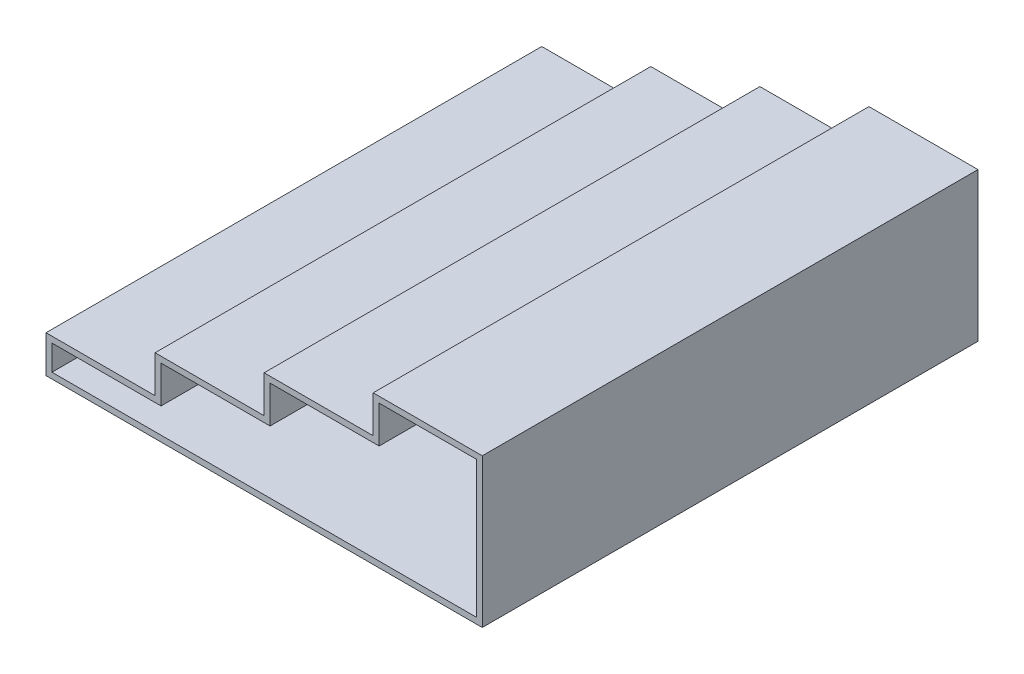
ISO-10303-21;
HEADER;
FILE_DESCRIPTION(('STEP AP214'),'2;1');
FILE_NAME('part.step','',(''),(''),'','','');
FILE_SCHEMA(('AUTOMOTIVE_DESIGN { 1 0 10303 214 1 1 1 1 }'));
ENDSEC;
DATA;
#1=APPLICATION_CONTEXT('core data for automotive mechanical design processes');
#2=APPLICATION_PROTOCOL_DEFINITION('international standard','automotive_design',2000,#1);
#3=PRODUCT_CONTEXT('',#1,'mechanical');
#4=PRODUCT('Part','Part','',(#3));
#5=PRODUCT_RELATED_PRODUCT_CATEGORY('part','',(#4));
#6=PRODUCT_DEFINITION_FORMATION('','',#4);
#7=PRODUCT_DEFINITION_CONTEXT('part definition',#1,'design');
#8=PRODUCT_DEFINITION('design','',#6,#7);
#9=PRODUCT_DEFINITION_SHAPE('','',#8);
#10=(LENGTH_UNIT() NAMED_UNIT(*) SI_UNIT(.MILLI.,.METRE.));
#11=(NAMED_UNIT(*) PLANE_ANGLE_UNIT() SI_UNIT($,.RADIAN.));
#12=(NAMED_UNIT(*) SI_UNIT($,.STERADIAN.) SOLID_ANGLE_UNIT());
#13=UNCERTAINTY_MEASURE_WITH_UNIT(LENGTH_MEASURE(1.E-05),#10,'distance_accuracy_value','');
#14=(GEOMETRIC_REPRESENTATION_CONTEXT(3) GLOBAL_UNCERTAINTY_ASSIGNED_CONTEXT((#13)) GLOBAL_UNIT_ASSIGNED_CONTEXT((#10,
#11,#12)) REPRESENTATION_CONTEXT('',''));
#15=CARTESIAN_POINT('',(0.,0.,0.));
#16=DIRECTION('',(0.,0.,1.));
#17=DIRECTION('',(1.,0.,0.));
#18=AXIS2_PLACEMENT_3D('',#15,#16,#17);
#19=CARTESIAN_POINT('',(0.,0.,125.));
#20=DIRECTION('',(0.,0.,-1.));
#21=DIRECTION('',(-1.,0.,0.));
#22=AXIS2_PLACEMENT_3D('',#19,#20,#21);
#23=PLANE('',#22);
#24=DIRECTION('',(1.,0.,0.));
#25=VECTOR('',#24,1.);
#26=CARTESIAN_POINT('',(220.,0.,125.));
#27=LINE('',#26,#25);
#28=CARTESIAN_POINT('',(0.,0.,125.));
#29=VERTEX_POINT('',#28);
#30=CARTESIAN_POINT('',(220.,0.,125.));
#31=VERTEX_POINT('',#30);
#32=EDGE_CURVE('E179',#29,#31,#27,.T.);
#33=ORIENTED_EDGE('',*,*,#32,.T.);
#34=DIRECTION('',(0.,1.,0.));
#35=VECTOR('',#34,1.);
#36=CARTESIAN_POINT('',(220.,75.,125.));
#37=LINE('',#36,#35);
#38=CARTESIAN_POINT('',(220.,75.,125.));
#39=VERTEX_POINT('',#38);
#40=EDGE_CURVE('E110',#31,#39,#37,.T.);
#41=ORIENTED_EDGE('',*,*,#40,.T.);
#42=DIRECTION('',(-1.,0.,0.));
#43=VECTOR('',#42,1.);
#44=CARTESIAN_POINT('',(165.,75.,125.));
#45=LINE('',#44,#43);
#46=CARTESIAN_POINT('',(165.,75.,125.));
#47=VERTEX_POINT('',#46);
#48=EDGE_CURVE('E200',#39,#47,#45,.T.);
#49=ORIENTED_EDGE('',*,*,#48,.T.);
#50=DIRECTION('',(0.,-1.,0.));
#51=VECTOR('',#50,1.);
#52=CARTESIAN_POINT('',(165.,56.25,125.));
#53=LINE('',#52,#51);
#54=CARTESIAN_POINT('',(165.,56.25,125.));
#55=VERTEX_POINT('',#54);
#56=EDGE_CURVE('E218',#47,#55,#53,.T.);
#57=ORIENTED_EDGE('',*,*,#56,.T.);
#58=DIRECTION('',(-1.,0.,0.));
#59=VECTOR('',#58,1.);
#60=CARTESIAN_POINT('',(110.,56.25,125.));
#61=LINE('',#60,#59);
#62=CARTESIAN_POINT('',(110.,56.25,125.));
#63=VERTEX_POINT('',#62);
#64=EDGE_CURVE('E215',#55,#63,#61,.T.);
#65=ORIENTED_EDGE('',*,*,#64,.T.);
#66=DIRECTION('',(0.,-1.,0.));
#67=VECTOR('',#66,1.);
#68=CARTESIAN_POINT('',(110.,37.5,125.));
#69=LINE('',#68,#67);
#70=CARTESIAN_POINT('',(110.,37.5,125.));
#71=VERTEX_POINT('',#70);
#72=EDGE_CURVE('E217',#63,#71,#69,.T.);
#73=ORIENTED_EDGE('',*,*,#72,.T.);
#74=DIRECTION('',(-1.,0.,0.));
#75=VECTOR('',#74,1.);
#76=CARTESIAN_POINT('',(55.,37.5,125.));
#77=LINE('',#76,#75);
#78=CARTESIAN_POINT('',(55.,37.5,125.));
#79=VERTEX_POINT('',#78);
#80=EDGE_CURVE('E138',#71,#79,#77,.T.);
#81=ORIENTED_EDGE('',*,*,#80,.T.);
#82=DIRECTION('',(0.,-1.,0.));
#83=VECTOR('',#82,1.);
#84=CARTESIAN_POINT('',(55.,18.75,125.));
#85=LINE('',#84,#83);
#86=CARTESIAN_POINT('',(55.,18.75,125.));
#87=VERTEX_POINT('',#86);
#88=EDGE_CURVE('E131',#79,#87,#85,.T.);
#89=ORIENTED_EDGE('',*,*,#88,.T.);
#90=DIRECTION('',(-1.,0.,0.));
#91=VECTOR('',#90,1.);
#92=CARTESIAN_POINT('',(0.,18.75,125.));
#93=LINE('',#92,#91);
#94=CARTESIAN_POINT('',(0.,18.75,125.));
#95=VERTEX_POINT('',#94);
#96=EDGE_CURVE('E135',#87,#95,#93,.T.);
#97=ORIENTED_EDGE('',*,*,#96,.T.);
#98=DIRECTION('',(0.,-1.,0.));
#99=VECTOR('',#98,1.);
#100=CARTESIAN_POINT('',(0.,0.,125.));
#101=LINE('',#100,#99);
#102=EDGE_CURVE('E63',#95,#29,#101,.T.);
#103=ORIENTED_EDGE('',*,*,#102,.T.);
#104=EDGE_LOOP('',(#33,#41,#49,#57,#65,#73,#81,#89,#97,#103));
#105=FACE_BOUND('',#104,.T.);
#106=DIRECTION('',(1.,0.,0.));
#107=VECTOR('',#106,1.);
#108=CARTESIAN_POINT('',(0.,3.,125.));
#109=LINE('',#108,#107);
#110=CARTESIAN_POINT('',(3.,3.,125.));
#111=VERTEX_POINT('',#110);
#112=CARTESIAN_POINT('',(217.,3.,125.));
#113=VERTEX_POINT('',#112);
#114=EDGE_CURVE('E252',#111,#113,#109,.T.);
#115=ORIENTED_EDGE('',*,*,#114,.F.);
#116=DIRECTION('',(0.,-1.,0.));
#117=VECTOR('',#116,1.);
#118=CARTESIAN_POINT('',(3.,0.,125.));
#119=LINE('',#118,#117);
#120=CARTESIAN_POINT('',(3.,15.75,125.));
#121=VERTEX_POINT('',#120);
#122=EDGE_CURVE('E226',#121,#111,#119,.T.);
#123=ORIENTED_EDGE('',*,*,#122,.F.);
#124=DIRECTION('',(-1.,0.,0.));
#125=VECTOR('',#124,1.);
#126=CARTESIAN_POINT('',(0.,15.75,125.));
#127=LINE('',#126,#125);
#128=CARTESIAN_POINT('',(58.,15.75,125.));
#129=VERTEX_POINT('',#128);
#130=EDGE_CURVE('E229',#129,#121,#127,.T.);
#131=ORIENTED_EDGE('',*,*,#130,.F.);
#132=DIRECTION('',(0.,-1.,0.));
#133=VECTOR('',#132,1.);
#134=CARTESIAN_POINT('',(58.,0.,125.));
#135=LINE('',#134,#133);
#136=CARTESIAN_POINT('',(58.,34.5,125.));
#137=VERTEX_POINT('',#136);
#138=EDGE_CURVE('E231',#137,#129,#135,.T.);
#139=ORIENTED_EDGE('',*,*,#138,.F.);
#140=DIRECTION('',(-1.,0.,0.));
#141=VECTOR('',#140,1.);
#142=CARTESIAN_POINT('',(0.,34.5,125.));
#143=LINE('',#142,#141);
#144=CARTESIAN_POINT('',(113.,34.5,125.));
#145=VERTEX_POINT('',#144);
#146=EDGE_CURVE('E234',#145,#137,#143,.T.);
#147=ORIENTED_EDGE('',*,*,#146,.F.);
#148=DIRECTION('',(0.,-1.,0.));
#149=VECTOR('',#148,1.);
#150=CARTESIAN_POINT('',(113.,0.,125.));
#151=LINE('',#150,#149);
#152=CARTESIAN_POINT('',(113.,53.25,125.));
#153=VERTEX_POINT('',#152);
#154=EDGE_CURVE('E237',#153,#145,#151,.T.);
#155=ORIENTED_EDGE('',*,*,#154,.F.);
#156=DIRECTION('',(-1.,0.,0.));
#157=VECTOR('',#156,1.);
#158=CARTESIAN_POINT('',(0.,53.25,125.));
#159=LINE('',#158,#157);
#160=CARTESIAN_POINT('',(168.,53.25,125.));
#161=VERTEX_POINT('',#160);
#162=EDGE_CURVE('E240',#161,#153,#159,.T.);
#163=ORIENTED_EDGE('',*,*,#162,.F.);
#164=DIRECTION('',(0.,-1.,0.));
#165=VECTOR('',#164,1.);
#166=CARTESIAN_POINT('',(168.,0.,125.));
#167=LINE('',#166,#165);
#168=CARTESIAN_POINT('',(168.,72.,125.));
#169=VERTEX_POINT('',#168);
#170=EDGE_CURVE('E243',#169,#161,#167,.T.);
#171=ORIENTED_EDGE('',*,*,#170,.F.);
#172=DIRECTION('',(-1.,0.,0.));
#173=VECTOR('',#172,1.);
#174=CARTESIAN_POINT('',(0.,72.,125.));
#175=LINE('',#174,#173);
#176=CARTESIAN_POINT('',(217.,72.,125.));
#177=VERTEX_POINT('',#176);
#178=EDGE_CURVE('E246',#177,#169,#175,.T.);
#179=ORIENTED_EDGE('',*,*,#178,.F.);
#180=DIRECTION('',(0.,1.,0.));
#181=VECTOR('',#180,1.);
#182=CARTESIAN_POINT('',(217.,0.,125.));
#183=LINE('',#182,#181);
#184=EDGE_CURVE('E249',#113,#177,#183,.T.);
#185=ORIENTED_EDGE('',*,*,#184,.F.);
#186=EDGE_LOOP('',(#115,#123,#131,#139,#147,#155,#163,#171,#179,#185));
#187=FACE_BOUND('',#186,.T.);
#188=ADVANCED_FACE('F39',(#105,#187),#23,.F.);
#189=CARTESIAN_POINT('',(220.,0.,125.));
#190=DIRECTION('',(0.,1.,0.));
#191=DIRECTION('',(0.,0.,1.));
#192=AXIS2_PLACEMENT_3D('',#189,#190,#191);
#193=PLANE('',#192);
#194=DIRECTION('',(1.,0.,0.));
#195=VECTOR('',#194,1.);
#196=CARTESIAN_POINT('',(220.,0.,-125.));
#197=LINE('',#196,#195);
#198=CARTESIAN_POINT('',(0.,0.,-125.));
#199=VERTEX_POINT('',#198);
#200=CARTESIAN_POINT('',(220.,0.,-125.));
#201=VERTEX_POINT('',#200);
#202=EDGE_CURVE('E159',#199,#201,#197,.T.);
#203=ORIENTED_EDGE('',*,*,#202,.T.);
#204=DIRECTION('',(0.,0.,-1.));
#205=VECTOR('',#204,1.);
#206=CARTESIAN_POINT('',(220.,0.,125.));
#207=LINE('',#206,#205);
#208=EDGE_CURVE('E11',#31,#201,#207,.T.);
#209=ORIENTED_EDGE('',*,*,#208,.F.);
#210=ORIENTED_EDGE('',*,*,#32,.F.);
#211=DIRECTION('',(0.,0.,-1.));
#212=VECTOR('',#211,1.);
#213=CARTESIAN_POINT('',(0.,0.,125.));
#214=LINE('',#213,#212);
#215=EDGE_CURVE('E155',#29,#199,#214,.T.);
#216=ORIENTED_EDGE('',*,*,#215,.T.);
#217=EDGE_LOOP('',(#203,#209,#210,#216));
#218=FACE_BOUND('',#217,.T.);
#219=ADVANCED_FACE('F41',(#218),#193,.F.);
#220=CARTESIAN_POINT('',(220.,75.,125.));
#221=DIRECTION('',(-1.,0.,0.));
#222=DIRECTION('',(0.,0.,1.));
#223=AXIS2_PLACEMENT_3D('',#220,#221,#222);
#224=PLANE('',#223);
#225=DIRECTION('',(0.,1.,0.));
#226=VECTOR('',#225,1.);
#227=CARTESIAN_POINT('',(220.,75.,-125.));
#228=LINE('',#227,#226);
#229=CARTESIAN_POINT('',(220.,75.,-125.));
#230=VERTEX_POINT('',#229);
#231=EDGE_CURVE('E162',#201,#230,#228,.T.);
#232=ORIENTED_EDGE('',*,*,#231,.T.);
#233=DIRECTION('',(0.,0.,-1.));
#234=VECTOR('',#233,1.);
#235=CARTESIAN_POINT('',(220.,75.,125.));
#236=LINE('',#235,#234);
#237=EDGE_CURVE('E47',#39,#230,#236,.T.);
#238=ORIENTED_EDGE('',*,*,#237,.F.);
#239=ORIENTED_EDGE('',*,*,#40,.F.);
#240=ORIENTED_EDGE('',*,*,#208,.T.);
#241=EDGE_LOOP('',(#232,#238,#239,#240));
#242=FACE_BOUND('',#241,.T.);
#243=ADVANCED_FACE('F393',(#242),#224,.F.);
#244=CARTESIAN_POINT('',(165.,75.,125.));
#245=DIRECTION('',(0.,-1.,0.));
#246=DIRECTION('',(0.,0.,-1.));
#247=AXIS2_PLACEMENT_3D('',#244,#245,#246);
#248=PLANE('',#247);
#249=DIRECTION('',(-1.,0.,0.));
#250=VECTOR('',#249,1.);
#251=CARTESIAN_POINT('',(165.,75.,-125.));
#252=LINE('',#251,#250);
#253=CARTESIAN_POINT('',(165.,75.,-125.));
#254=VERTEX_POINT('',#253);
#255=EDGE_CURVE('E165',#230,#254,#252,.T.);
#256=ORIENTED_EDGE('',*,*,#255,.T.);
#257=DIRECTION('',(0.,0.,-1.));
#258=VECTOR('',#257,1.);
#259=CARTESIAN_POINT('',(165.,75.,125.));
#260=LINE('',#259,#258);
#261=EDGE_CURVE('E192',#47,#254,#260,.T.);
#262=ORIENTED_EDGE('',*,*,#261,.F.);
#263=ORIENTED_EDGE('',*,*,#48,.F.);
#264=ORIENTED_EDGE('',*,*,#237,.T.);
#265=EDGE_LOOP('',(#256,#262,#263,#264));
#266=FACE_BOUND('',#265,.T.);
#267=ADVANCED_FACE('F198',(#266),#248,.F.);
#268=CARTESIAN_POINT('',(165.,56.25,125.));
#269=DIRECTION('',(1.,0.,0.));
#270=DIRECTION('',(0.,0.,-1.));
#271=AXIS2_PLACEMENT_3D('',#268,#269,#270);
#272=PLANE('',#271);
#273=DIRECTION('',(0.,-1.,0.));
#274=VECTOR('',#273,1.);
#275=CARTESIAN_POINT('',(165.,56.25,-125.));
#276=LINE('',#275,#274);
#277=CARTESIAN_POINT('',(165.,56.25,-125.));
#278=VERTEX_POINT('',#277);
#279=EDGE_CURVE('E167',#254,#278,#276,.T.);
#280=ORIENTED_EDGE('',*,*,#279,.T.);
#281=DIRECTION('',(0.,0.,-1.));
#282=VECTOR('',#281,1.);
#283=CARTESIAN_POINT('',(165.,56.25,125.));
#284=LINE('',#283,#282);
#285=EDGE_CURVE('E189',#55,#278,#284,.T.);
#286=ORIENTED_EDGE('',*,*,#285,.F.);
#287=ORIENTED_EDGE('',*,*,#56,.F.);
#288=ORIENTED_EDGE('',*,*,#261,.T.);
#289=EDGE_LOOP('',(#280,#286,#287,#288));
#290=FACE_BOUND('',#289,.T.);
#291=ADVANCED_FACE('F209',(#290),#272,.F.);
#292=CARTESIAN_POINT('',(110.,56.25,125.));
#293=DIRECTION('',(0.,-1.,0.));
#294=DIRECTION('',(0.,0.,-1.));
#295=AXIS2_PLACEMENT_3D('',#292,#293,#294);
#296=PLANE('',#295);
#297=DIRECTION('',(-1.,0.,0.));
#298=VECTOR('',#297,1.);
#299=CARTESIAN_POINT('',(110.,56.25,-125.));
#300=LINE('',#299,#298);
#301=CARTESIAN_POINT('',(110.,56.25,-125.));
#302=VERTEX_POINT('',#301);
#303=EDGE_CURVE('E169',#278,#302,#300,.T.);
#304=ORIENTED_EDGE('',*,*,#303,.T.);
#305=DIRECTION('',(0.,0.,-1.));
#306=VECTOR('',#305,1.);
#307=CARTESIAN_POINT('',(110.,56.25,125.));
#308=LINE('',#307,#306);
#309=EDGE_CURVE('E186',#63,#302,#308,.T.);
#310=ORIENTED_EDGE('',*,*,#309,.F.);
#311=ORIENTED_EDGE('',*,*,#64,.F.);
#312=ORIENTED_EDGE('',*,*,#285,.T.);
#313=EDGE_LOOP('',(#304,#310,#311,#312));
#314=FACE_BOUND('',#313,.T.);
#315=ADVANCED_FACE('F213',(#314),#296,.F.);
#316=CARTESIAN_POINT('',(110.,37.5,125.));
#317=DIRECTION('',(1.,0.,0.));
#318=DIRECTION('',(0.,0.,-1.));
#319=AXIS2_PLACEMENT_3D('',#316,#317,#318);
#320=PLANE('',#319);
#321=DIRECTION('',(0.,-1.,0.));
#322=VECTOR('',#321,1.);
#323=CARTESIAN_POINT('',(110.,37.5,-125.));
#324=LINE('',#323,#322);
#325=CARTESIAN_POINT('',(110.,37.5,-125.));
#326=VERTEX_POINT('',#325);
#327=EDGE_CURVE('E171',#302,#326,#324,.T.);
#328=ORIENTED_EDGE('',*,*,#327,.T.);
#329=DIRECTION('',(0.,0.,-1.));
#330=VECTOR('',#329,1.);
#331=CARTESIAN_POINT('',(110.,37.5,125.));
#332=LINE('',#331,#330);
#333=EDGE_CURVE('E183',#71,#326,#332,.T.);
#334=ORIENTED_EDGE('',*,*,#333,.F.);
#335=ORIENTED_EDGE('',*,*,#72,.F.);
#336=ORIENTED_EDGE('',*,*,#309,.T.);
#337=EDGE_LOOP('',(#328,#334,#335,#336));
#338=FACE_BOUND('',#337,.T.);
#339=ADVANCED_FACE('F408',(#338),#320,.F.);
#340=CARTESIAN_POINT('',(55.,37.5,125.));
#341=DIRECTION('',(0.,-1.,0.));
#342=DIRECTION('',(0.,0.,-1.));
#343=AXIS2_PLACEMENT_3D('',#340,#341,#342);
#344=PLANE('',#343);
#345=DIRECTION('',(-1.,0.,0.));
#346=VECTOR('',#345,1.);
#347=CARTESIAN_POINT('',(55.,37.5,-125.));
#348=LINE('',#347,#346);
#349=CARTESIAN_POINT('',(55.,37.5,-125.));
#350=VERTEX_POINT('',#349);
#351=EDGE_CURVE('E173',#326,#350,#348,.T.);
#352=ORIENTED_EDGE('',*,*,#351,.T.);
#353=DIRECTION('',(0.,0.,-1.));
#354=VECTOR('',#353,1.);
#355=CARTESIAN_POINT('',(55.,37.5,125.));
#356=LINE('',#355,#354);
#357=EDGE_CURVE('E150',#79,#350,#356,.T.);
#358=ORIENTED_EDGE('',*,*,#357,.F.);
#359=ORIENTED_EDGE('',*,*,#80,.F.);
#360=ORIENTED_EDGE('',*,*,#333,.T.);
#361=EDGE_LOOP('',(#352,#358,#359,#360));
#362=FACE_BOUND('',#361,.T.);
#363=ADVANCED_FACE('F405',(#362),#344,.F.);
#364=CARTESIAN_POINT('',(55.,18.75,125.));
#365=DIRECTION('',(1.,0.,0.));
#366=DIRECTION('',(0.,0.,-1.));
#367=AXIS2_PLACEMENT_3D('',#364,#365,#366);
#368=PLANE('',#367);
#369=DIRECTION('',(0.,-1.,0.));
#370=VECTOR('',#369,1.);
#371=CARTESIAN_POINT('',(55.,18.75,-125.));
#372=LINE('',#371,#370);
#373=CARTESIAN_POINT('',(55.,18.75,-125.));
#374=VERTEX_POINT('',#373);
#375=EDGE_CURVE('E147',#350,#374,#372,.T.);
#376=ORIENTED_EDGE('',*,*,#375,.T.);
#377=DIRECTION('',(0.,0.,-1.));
#378=VECTOR('',#377,1.);
#379=CARTESIAN_POINT('',(55.,18.75,125.));
#380=LINE('',#379,#378);
#381=EDGE_CURVE('E144',#87,#374,#380,.T.);
#382=ORIENTED_EDGE('',*,*,#381,.F.);
#383=ORIENTED_EDGE('',*,*,#88,.F.);
#384=ORIENTED_EDGE('',*,*,#357,.T.);
#385=EDGE_LOOP('',(#376,#382,#383,#384));
#386=FACE_BOUND('',#385,.T.);
#387=ADVANCED_FACE('F145',(#386),#368,.F.);
#388=CARTESIAN_POINT('',(0.,18.75,125.));
#389=DIRECTION('',(0.,-1.,0.));
#390=DIRECTION('',(1.,0.,0.));
#391=AXIS2_PLACEMENT_3D('',#388,#389,#390);
#392=PLANE('',#391);
#393=DIRECTION('',(-1.,0.,0.));
#394=VECTOR('',#393,1.);
#395=CARTESIAN_POINT('',(0.,18.75,-125.));
#396=LINE('',#395,#394);
#397=CARTESIAN_POINT('',(0.,18.75,-125.));
#398=VERTEX_POINT('',#397);
#399=EDGE_CURVE('E176',#374,#398,#396,.T.);
#400=ORIENTED_EDGE('',*,*,#399,.T.);
#401=DIRECTION('',(0.,0.,-1.));
#402=VECTOR('',#401,1.);
#403=CARTESIAN_POINT('',(0.,18.75,125.));
#404=LINE('',#403,#402);
#405=EDGE_CURVE('E151',#95,#398,#404,.T.);
#406=ORIENTED_EDGE('',*,*,#405,.F.);
#407=ORIENTED_EDGE('',*,*,#96,.F.);
#408=ORIENTED_EDGE('',*,*,#381,.T.);
#409=EDGE_LOOP('',(#400,#406,#407,#408));
#410=FACE_BOUND('',#409,.T.);
#411=ADVANCED_FACE('F153',(#410),#392,.F.);
#412=CARTESIAN_POINT('',(0.,0.,125.));
#413=DIRECTION('',(1.,0.,0.));
#414=DIRECTION('',(0.,0.,-1.));
#415=AXIS2_PLACEMENT_3D('',#412,#413,#414);
#416=PLANE('',#415);
#417=DIRECTION('',(0.,-1.,0.));
#418=VECTOR('',#417,1.);
#419=CARTESIAN_POINT('',(0.,0.,-125.));
#420=LINE('',#419,#418);
#421=EDGE_CURVE('E102',#398,#199,#420,.T.);
#422=ORIENTED_EDGE('',*,*,#421,.T.);
#423=ORIENTED_EDGE('',*,*,#215,.F.);
#424=ORIENTED_EDGE('',*,*,#102,.F.);
#425=ORIENTED_EDGE('',*,*,#405,.T.);
#426=EDGE_LOOP('',(#422,#423,#424,#425));
#427=FACE_BOUND('',#426,.T.);
#428=ADVANCED_FACE('F398',(#427),#416,.F.);
#429=CARTESIAN_POINT('',(0.,0.,-125.));
#430=DIRECTION('',(0.,0.,-1.));
#431=DIRECTION('',(-1.,0.,0.));
#432=AXIS2_PLACEMENT_3D('',#429,#430,#431);
#433=PLANE('',#432);
#434=ORIENTED_EDGE('',*,*,#202,.F.);
#435=ORIENTED_EDGE('',*,*,#421,.F.);
#436=ORIENTED_EDGE('',*,*,#399,.F.);
#437=ORIENTED_EDGE('',*,*,#375,.F.);
#438=ORIENTED_EDGE('',*,*,#351,.F.);
#439=ORIENTED_EDGE('',*,*,#327,.F.);
#440=ORIENTED_EDGE('',*,*,#303,.F.);
#441=ORIENTED_EDGE('',*,*,#279,.F.);
#442=ORIENTED_EDGE('',*,*,#255,.F.);
#443=ORIENTED_EDGE('',*,*,#231,.F.);
#444=EDGE_LOOP('',(#434,#435,#436,#437,#438,#439,#440,#441,#442,#443));
#445=FACE_BOUND('',#444,.T.);
#446=ADVANCED_FACE('F204',(#445),#433,.T.);
#447=CARTESIAN_POINT('',(220.,3.,125.));
#448=DIRECTION('',(0.,1.,0.));
#449=DIRECTION('',(0.,0.,1.));
#450=AXIS2_PLACEMENT_3D('',#447,#448,#449);
#451=PLANE('',#450);
#452=DIRECTION('',(1.,0.,0.));
#453=VECTOR('',#452,1.);
#454=CARTESIAN_POINT('',(0.,3.,-122.));
#455=LINE('',#454,#453);
#456=CARTESIAN_POINT('',(3.,3.,-122.));
#457=VERTEX_POINT('',#456);
#458=CARTESIAN_POINT('',(217.,3.,-122.));
#459=VERTEX_POINT('',#458);
#460=EDGE_CURVE('E304',#457,#459,#455,.T.);
#461=ORIENTED_EDGE('',*,*,#460,.F.);
#462=DIRECTION('',(0.,0.,-1.));
#463=VECTOR('',#462,1.);
#464=CARTESIAN_POINT('',(3.,3.,125.));
#465=LINE('',#464,#463);
#466=EDGE_CURVE('E228',#111,#457,#465,.T.);
#467=ORIENTED_EDGE('',*,*,#466,.F.);
#468=ORIENTED_EDGE('',*,*,#114,.T.);
#469=DIRECTION('',(0.,0.,-1.));
#470=VECTOR('',#469,1.);
#471=CARTESIAN_POINT('',(217.,3.,125.));
#472=LINE('',#471,#470);
#473=EDGE_CURVE('E163',#113,#459,#472,.T.);
#474=ORIENTED_EDGE('',*,*,#473,.T.);
#475=EDGE_LOOP('',(#461,#467,#468,#474));
#476=FACE_BOUND('',#475,.T.);
#477=ADVANCED_FACE('F320',(#476),#451,.T.);
#478=CARTESIAN_POINT('',(217.,75.,125.));
#479=DIRECTION('',(-1.,0.,0.));
#480=DIRECTION('',(0.,0.,1.));
#481=AXIS2_PLACEMENT_3D('',#478,#479,#480);
#482=PLANE('',#481);
#483=DIRECTION('',(0.,1.,0.));
#484=VECTOR('',#483,1.);
#485=CARTESIAN_POINT('',(217.,0.,-122.));
#486=LINE('',#485,#484);
#487=CARTESIAN_POINT('',(217.,72.,-122.));
#488=VERTEX_POINT('',#487);
#489=EDGE_CURVE('E299',#459,#488,#486,.T.);
#490=ORIENTED_EDGE('',*,*,#489,.F.);
#491=ORIENTED_EDGE('',*,*,#473,.F.);
#492=ORIENTED_EDGE('',*,*,#184,.T.);
#493=DIRECTION('',(0.,0.,-1.));
#494=VECTOR('',#493,1.);
#495=CARTESIAN_POINT('',(217.,72.,125.));
#496=LINE('',#495,#494);
#497=EDGE_CURVE('E296',#177,#488,#496,.T.);
#498=ORIENTED_EDGE('',*,*,#497,.T.);
#499=EDGE_LOOP('',(#490,#491,#492,#498));
#500=FACE_BOUND('',#499,.T.);
#501=ADVANCED_FACE('F353',(#500),#482,.T.);
#502=CARTESIAN_POINT('',(165.,72.,125.));
#503=DIRECTION('',(0.,-1.,0.));
#504=DIRECTION('',(0.,0.,-1.));
#505=AXIS2_PLACEMENT_3D('',#502,#503,#504);
#506=PLANE('',#505);
#507=DIRECTION('',(-1.,0.,0.));
#508=VECTOR('',#507,1.);
#509=CARTESIAN_POINT('',(0.,72.,-122.));
#510=LINE('',#509,#508);
#511=CARTESIAN_POINT('',(168.,72.,-122.));
#512=VERTEX_POINT('',#511);
#513=EDGE_CURVE('E293',#488,#512,#510,.T.);
#514=ORIENTED_EDGE('',*,*,#513,.F.);
#515=ORIENTED_EDGE('',*,*,#497,.F.);
#516=ORIENTED_EDGE('',*,*,#178,.T.);
#517=DIRECTION('',(0.,0.,-1.));
#518=VECTOR('',#517,1.);
#519=CARTESIAN_POINT('',(168.,72.,125.));
#520=LINE('',#519,#518);
#521=EDGE_CURVE('E290',#169,#512,#520,.T.);
#522=ORIENTED_EDGE('',*,*,#521,.T.);
#523=EDGE_LOOP('',(#514,#515,#516,#522));
#524=FACE_BOUND('',#523,.T.);
#525=ADVANCED_FACE('F359',(#524),#506,.T.);
#526=CARTESIAN_POINT('',(168.,56.25,125.));
#527=DIRECTION('',(1.,0.,0.));
#528=DIRECTION('',(0.,0.,-1.));
#529=AXIS2_PLACEMENT_3D('',#526,#527,#528);
#530=PLANE('',#529);
#531=DIRECTION('',(0.,-1.,0.));
#532=VECTOR('',#531,1.);
#533=CARTESIAN_POINT('',(168.,0.,-122.));
#534=LINE('',#533,#532);
#535=CARTESIAN_POINT('',(168.,53.25,-122.));
#536=VERTEX_POINT('',#535);
#537=EDGE_CURVE('E287',#512,#536,#534,.T.);
#538=ORIENTED_EDGE('',*,*,#537,.F.);
#539=ORIENTED_EDGE('',*,*,#521,.F.);
#540=ORIENTED_EDGE('',*,*,#170,.T.);
#541=DIRECTION('',(0.,0.,-1.));
#542=VECTOR('',#541,1.);
#543=CARTESIAN_POINT('',(168.,53.25,125.));
#544=LINE('',#543,#542);
#545=EDGE_CURVE('E284',#161,#536,#544,.T.);
#546=ORIENTED_EDGE('',*,*,#545,.T.);
#547=EDGE_LOOP('',(#538,#539,#540,#546));
#548=FACE_BOUND('',#547,.T.);
#549=ADVANCED_FACE('F501',(#548),#530,.T.);
#550=CARTESIAN_POINT('',(110.,53.25,125.));
#551=DIRECTION('',(0.,-1.,0.));
#552=DIRECTION('',(0.,0.,-1.));
#553=AXIS2_PLACEMENT_3D('',#550,#551,#552);
#554=PLANE('',#553);
#555=DIRECTION('',(-1.,0.,0.));
#556=VECTOR('',#555,1.);
#557=CARTESIAN_POINT('',(0.,53.25,-122.));
#558=LINE('',#557,#556);
#559=CARTESIAN_POINT('',(113.,53.25,-122.));
#560=VERTEX_POINT('',#559);
#561=EDGE_CURVE('E281',#536,#560,#558,.T.);
#562=ORIENTED_EDGE('',*,*,#561,.F.);
#563=ORIENTED_EDGE('',*,*,#545,.F.);
#564=ORIENTED_EDGE('',*,*,#162,.T.);
#565=DIRECTION('',(0.,0.,-1.));
#566=VECTOR('',#565,1.);
#567=CARTESIAN_POINT('',(113.,53.25,125.));
#568=LINE('',#567,#566);
#569=EDGE_CURVE('E278',#153,#560,#568,.T.);
#570=ORIENTED_EDGE('',*,*,#569,.T.);
#571=EDGE_LOOP('',(#562,#563,#564,#570));
#572=FACE_BOUND('',#571,.T.);
#573=ADVANCED_FACE('F510',(#572),#554,.T.);
#574=CARTESIAN_POINT('',(113.,37.5,125.));
#575=DIRECTION('',(1.,0.,0.));
#576=DIRECTION('',(0.,0.,-1.));
#577=AXIS2_PLACEMENT_3D('',#574,#575,#576);
#578=PLANE('',#577);
#579=DIRECTION('',(0.,-1.,0.));
#580=VECTOR('',#579,1.);
#581=CARTESIAN_POINT('',(113.,0.,-122.));
#582=LINE('',#581,#580);
#583=CARTESIAN_POINT('',(113.,34.5,-122.));
#584=VERTEX_POINT('',#583);
#585=EDGE_CURVE('E275',#560,#584,#582,.T.);
#586=ORIENTED_EDGE('',*,*,#585,.F.);
#587=ORIENTED_EDGE('',*,*,#569,.F.);
#588=ORIENTED_EDGE('',*,*,#154,.T.);
#589=DIRECTION('',(0.,0.,-1.));
#590=VECTOR('',#589,1.);
#591=CARTESIAN_POINT('',(113.,34.5,125.));
#592=LINE('',#591,#590);
#593=EDGE_CURVE('E272',#145,#584,#592,.T.);
#594=ORIENTED_EDGE('',*,*,#593,.T.);
#595=EDGE_LOOP('',(#586,#587,#588,#594));
#596=FACE_BOUND('',#595,.T.);
#597=ADVANCED_FACE('F520',(#596),#578,.T.);
#598=CARTESIAN_POINT('',(55.,34.5,125.));
#599=DIRECTION('',(0.,-1.,0.));
#600=DIRECTION('',(0.,0.,-1.));
#601=AXIS2_PLACEMENT_3D('',#598,#599,#600);
#602=PLANE('',#601);
#603=DIRECTION('',(-1.,0.,0.));
#604=VECTOR('',#603,1.);
#605=CARTESIAN_POINT('',(0.,34.5,-122.));
#606=LINE('',#605,#604);
#607=CARTESIAN_POINT('',(58.,34.5,-122.));
#608=VERTEX_POINT('',#607);
#609=EDGE_CURVE('E269',#584,#608,#606,.T.);
#610=ORIENTED_EDGE('',*,*,#609,.F.);
#611=ORIENTED_EDGE('',*,*,#593,.F.);
#612=ORIENTED_EDGE('',*,*,#146,.T.);
#613=DIRECTION('',(0.,0.,-1.));
#614=VECTOR('',#613,1.);
#615=CARTESIAN_POINT('',(58.,34.5,125.));
#616=LINE('',#615,#614);
#617=EDGE_CURVE('E266',#137,#608,#616,.T.);
#618=ORIENTED_EDGE('',*,*,#617,.T.);
#619=EDGE_LOOP('',(#610,#611,#612,#618));
#620=FACE_BOUND('',#619,.T.);
#621=ADVANCED_FACE('F384',(#620),#602,.T.);
#622=CARTESIAN_POINT('',(58.,18.75,125.));
#623=DIRECTION('',(1.,0.,0.));
#624=DIRECTION('',(0.,0.,-1.));
#625=AXIS2_PLACEMENT_3D('',#622,#623,#624);
#626=PLANE('',#625);
#627=DIRECTION('',(0.,-1.,0.));
#628=VECTOR('',#627,1.);
#629=CARTESIAN_POINT('',(58.,0.,-122.));
#630=LINE('',#629,#628);
#631=CARTESIAN_POINT('',(58.,15.75,-122.));
#632=VERTEX_POINT('',#631);
#633=EDGE_CURVE('E263',#608,#632,#630,.T.);
#634=ORIENTED_EDGE('',*,*,#633,.F.);
#635=ORIENTED_EDGE('',*,*,#617,.F.);
#636=ORIENTED_EDGE('',*,*,#138,.T.);
#637=DIRECTION('',(0.,0.,-1.));
#638=VECTOR('',#637,1.);
#639=CARTESIAN_POINT('',(58.,15.75,125.));
#640=LINE('',#639,#638);
#641=EDGE_CURVE('E260',#129,#632,#640,.T.);
#642=ORIENTED_EDGE('',*,*,#641,.T.);
#643=EDGE_LOOP('',(#634,#635,#636,#642));
#644=FACE_BOUND('',#643,.T.);
#645=ADVANCED_FACE('F374',(#644),#626,.T.);
#646=CARTESIAN_POINT('',(0.,15.75,125.));
#647=DIRECTION('',(0.,-1.,0.));
#648=DIRECTION('',(1.,0.,0.));
#649=AXIS2_PLACEMENT_3D('',#646,#647,#648);
#650=PLANE('',#649);
#651=DIRECTION('',(-1.,0.,0.));
#652=VECTOR('',#651,1.);
#653=CARTESIAN_POINT('',(0.,15.75,-122.));
#654=LINE('',#653,#652);
#655=CARTESIAN_POINT('',(3.,15.75,-122.));
#656=VERTEX_POINT('',#655);
#657=EDGE_CURVE('E258',#632,#656,#654,.T.);
#658=ORIENTED_EDGE('',*,*,#657,.F.);
#659=ORIENTED_EDGE('',*,*,#641,.F.);
#660=ORIENTED_EDGE('',*,*,#130,.T.);
#661=DIRECTION('',(0.,0.,-1.));
#662=VECTOR('',#661,1.);
#663=CARTESIAN_POINT('',(3.,15.75,125.));
#664=LINE('',#663,#662);
#665=EDGE_CURVE('E54',#121,#656,#664,.T.);
#666=ORIENTED_EDGE('',*,*,#665,.T.);
#667=EDGE_LOOP('',(#658,#659,#660,#666));
#668=FACE_BOUND('',#667,.T.);
#669=ADVANCED_FACE('F376',(#668),#650,.T.);
#670=CARTESIAN_POINT('',(3.,0.,125.));
#671=DIRECTION('',(1.,0.,0.));
#672=DIRECTION('',(0.,0.,-1.));
#673=AXIS2_PLACEMENT_3D('',#670,#671,#672);
#674=PLANE('',#673);
#675=DIRECTION('',(0.,-1.,0.));
#676=VECTOR('',#675,1.);
#677=CARTESIAN_POINT('',(3.,0.,-122.));
#678=LINE('',#677,#676);
#679=EDGE_CURVE('E255',#656,#457,#678,.T.);
#680=ORIENTED_EDGE('',*,*,#679,.F.);
#681=ORIENTED_EDGE('',*,*,#665,.F.);
#682=ORIENTED_EDGE('',*,*,#122,.T.);
#683=ORIENTED_EDGE('',*,*,#466,.T.);
#684=EDGE_LOOP('',(#680,#681,#682,#683));
#685=FACE_BOUND('',#684,.T.);
#686=ADVANCED_FACE('F348',(#685),#674,.T.);
#687=CARTESIAN_POINT('',(0.,0.,-122.));
#688=DIRECTION('',(0.,0.,-1.));
#689=DIRECTION('',(-1.,0.,0.));
#690=AXIS2_PLACEMENT_3D('',#687,#688,#689);
#691=PLANE('',#690);
#692=ORIENTED_EDGE('',*,*,#460,.T.);
#693=ORIENTED_EDGE('',*,*,#489,.T.);
#694=ORIENTED_EDGE('',*,*,#513,.T.);
#695=ORIENTED_EDGE('',*,*,#537,.T.);
#696=ORIENTED_EDGE('',*,*,#561,.T.);
#697=ORIENTED_EDGE('',*,*,#585,.T.);
#698=ORIENTED_EDGE('',*,*,#609,.T.);
#699=ORIENTED_EDGE('',*,*,#633,.T.);
#700=ORIENTED_EDGE('',*,*,#657,.T.);
#701=ORIENTED_EDGE('',*,*,#679,.T.);
#702=EDGE_LOOP('',(#692,#693,#694,#695,#696,#697,#698,#699,#700,#701));
#703=FACE_BOUND('',#702,.T.);
#704=ADVANCED_FACE('F313',(#703),#691,.F.);
#705=CLOSED_SHELL('',(#188,#219,#243,#267,#291,#315,#339,#363,#387,#411,#428,#446,#477,#501,
#525,#549,#573,#597,#621,#645,#669,#686,#704));
#706=MANIFOLD_SOLID_BREP('B2',#705);
#707=ADVANCED_BREP_SHAPE_REPRESENTATION('',(#18,#706),#14);
#708=SHAPE_DEFINITION_REPRESENTATION(#9,#707);
ENDSEC;
END-ISO-10303-21;
